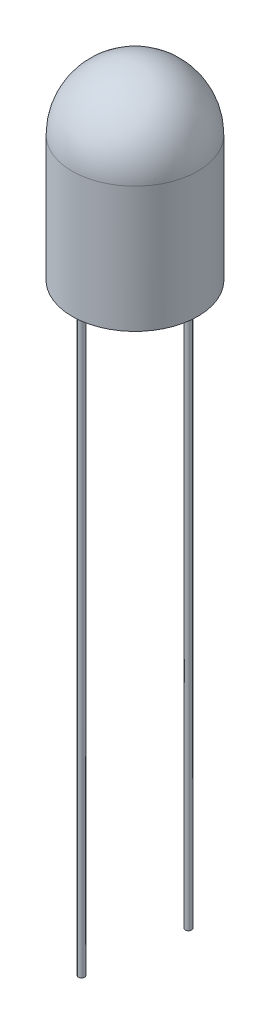
ISO-10303-21;
HEADER;
FILE_DESCRIPTION(('STEP AP214'),'2;1');
FILE_NAME('part.step','',(''),(''),'','','');
FILE_SCHEMA(('AUTOMOTIVE_DESIGN { 1 0 10303 214 1 1 1 1 }'));
ENDSEC;
DATA;
#1=APPLICATION_CONTEXT('core data for automotive mechanical design processes');
#2=APPLICATION_PROTOCOL_DEFINITION('international standard','automotive_design',2000,#1);
#3=PRODUCT_CONTEXT('',#1,'mechanical');
#4=PRODUCT('Part','Part','',(#3));
#5=PRODUCT_RELATED_PRODUCT_CATEGORY('part','',(#4));
#6=PRODUCT_DEFINITION_FORMATION('','',#4);
#7=PRODUCT_DEFINITION_CONTEXT('part definition',#1,'design');
#8=PRODUCT_DEFINITION('design','',#6,#7);
#9=PRODUCT_DEFINITION_SHAPE('','',#8);
#10=(LENGTH_UNIT() NAMED_UNIT(*) SI_UNIT(.MILLI.,.METRE.));
#11=(NAMED_UNIT(*) PLANE_ANGLE_UNIT() SI_UNIT($,.RADIAN.));
#12=(NAMED_UNIT(*) SI_UNIT($,.STERADIAN.) SOLID_ANGLE_UNIT());
#13=UNCERTAINTY_MEASURE_WITH_UNIT(LENGTH_MEASURE(1.E-05),#10,'distance_accuracy_value','');
#14=(GEOMETRIC_REPRESENTATION_CONTEXT(3) GLOBAL_UNCERTAINTY_ASSIGNED_CONTEXT((#13)) GLOBAL_UNIT_ASSIGNED_CONTEXT((#10,
#11,#12)) REPRESENTATION_CONTEXT('',''));
#15=CARTESIAN_POINT('',(0.,0.,0.));
#16=DIRECTION('',(0.,0.,1.));
#17=DIRECTION('',(1.,0.,0.));
#18=AXIS2_PLACEMENT_3D('',#15,#16,#17);
#19=CARTESIAN_POINT('',(0.,0.,0.));
#20=DIRECTION('',(0.,1.,0.));
#21=DIRECTION('',(0.,0.,1.));
#22=AXIS2_PLACEMENT_3D('',#19,#20,#21);
#23=PLANE('',#22);
#24=CARTESIAN_POINT('',(0.85,0.,0.));
#25=DIRECTION('',(0.,1.,0.));
#26=DIRECTION('',(0.,0.,1.));
#27=AXIS2_PLACEMENT_3D('',#24,#25,#26);
#28=CIRCLE('',#27,0.0500000000000001);
#29=CARTESIAN_POINT('',(0.85,0.,0.0500000000000001));
#30=VERTEX_POINT('',#29);
#31=EDGE_CURVE('E10',#30,#30,#28,.F.);
#32=ORIENTED_EDGE('',*,*,#31,.F.);
#33=EDGE_LOOP('',(#32));
#34=FACE_BOUND('',#33,.T.);
#35=CARTESIAN_POINT('',(-0.85,0.,0.));
#36=DIRECTION('',(0.,1.,0.));
#37=DIRECTION('',(0.,0.,1.));
#38=AXIS2_PLACEMENT_3D('',#35,#36,#37);
#39=CIRCLE('',#38,0.0500000000000001);
#40=CARTESIAN_POINT('',(-0.85,0.,0.0500000000000001));
#41=VERTEX_POINT('',#40);
#42=EDGE_CURVE('E40',#41,#41,#39,.F.);
#43=ORIENTED_EDGE('',*,*,#42,.F.);
#44=EDGE_LOOP('',(#43));
#45=FACE_BOUND('',#44,.T.);
#46=CARTESIAN_POINT('',(0.,0.,0.));
#47=DIRECTION('',(0.,1.,0.));
#48=DIRECTION('',(0.,0.,1.));
#49=AXIS2_PLACEMENT_3D('',#46,#47,#48);
#50=CIRCLE('',#49,1.);
#51=CARTESIAN_POINT('',(0.,0.,1.));
#52=VERTEX_POINT('',#51);
#53=EDGE_CURVE('E44',#52,#52,#50,.T.);
#54=ORIENTED_EDGE('',*,*,#53,.F.);
#55=EDGE_LOOP('',(#54));
#56=FACE_BOUND('',#55,.T.);
#57=ADVANCED_FACE('F34',(#34,#45,#56),#23,.F.);
#58=CARTESIAN_POINT('',(0.,4.37497709116596,0.));
#59=DIRECTION('',(0.,1.,0.));
#60=DIRECTION('',(0.,0.,1.));
#61=AXIS2_PLACEMENT_3D('',#58,#59,#60);
#62=CYLINDRICAL_SURFACE('',#61,1.);
#63=CARTESIAN_POINT('',(0.,2.,0.));
#64=DIRECTION('',(0.,1.,0.));
#65=DIRECTION('',(0.,0.,1.));
#66=AXIS2_PLACEMENT_3D('',#63,#64,#65);
#67=CIRCLE('',#66,1.);
#68=CARTESIAN_POINT('',(0.,2.,1.));
#69=VERTEX_POINT('',#68);
#70=EDGE_CURVE('E48',#69,#69,#67,.T.);
#71=ORIENTED_EDGE('',*,*,#70,.F.);
#72=EDGE_LOOP('',(#71));
#73=FACE_BOUND('',#72,.T.);
#74=ORIENTED_EDGE('',*,*,#53,.T.);
#75=EDGE_LOOP('',(#74));
#76=FACE_BOUND('',#75,.T.);
#77=ADVANCED_FACE('F75',(#73,#76),#62,.T.);
#78=CARTESIAN_POINT('',(0.,2.,0.));
#79=DIRECTION('',(0.,1.,0.));
#80=DIRECTION('',(1.,0.,0.));
#81=AXIS2_PLACEMENT_3D('',#78,#79,#80);
#82=SPHERICAL_SURFACE('',#81,1.);
#83=ORIENTED_EDGE('',*,*,#70,.T.);
#84=EDGE_LOOP('',(#83));
#85=FACE_BOUND('',#84,.T.);
#86=ADVANCED_FACE('F80',(#85),#82,.T.);
#87=CARTESIAN_POINT('',(-0.85,-10.,0.));
#88=DIRECTION('',(0.,1.,0.));
#89=DIRECTION('',(0.,0.,1.));
#90=AXIS2_PLACEMENT_3D('',#87,#88,#89);
#91=CYLINDRICAL_SURFACE('',#90,0.0500000000000001);
#92=CARTESIAN_POINT('',(-0.85,-10.,0.));
#93=DIRECTION('',(0.,-1.,0.));
#94=DIRECTION('',(0.,0.,-1.));
#95=AXIS2_PLACEMENT_3D('',#92,#93,#94);
#96=CIRCLE('',#95,0.0500000000000001);
#97=CARTESIAN_POINT('',(-0.85,-10.,-0.0500000000000001));
#98=VERTEX_POINT('',#97);
#99=EDGE_CURVE('E53',#98,#98,#96,.T.);
#100=ORIENTED_EDGE('',*,*,#99,.F.);
#101=EDGE_LOOP('',(#100));
#102=FACE_BOUND('',#101,.T.);
#103=ORIENTED_EDGE('',*,*,#42,.T.);
#104=EDGE_LOOP('',(#103));
#105=FACE_BOUND('',#104,.T.);
#106=ADVANCED_FACE('F71',(#102,#105),#91,.T.);
#107=CARTESIAN_POINT('',(0.,-10.,0.));
#108=DIRECTION('',(0.,-1.,0.));
#109=DIRECTION('',(0.,0.,-1.));
#110=AXIS2_PLACEMENT_3D('',#107,#108,#109);
#111=PLANE('',#110);
#112=ORIENTED_EDGE('',*,*,#99,.T.);
#113=EDGE_LOOP('',(#112));
#114=FACE_BOUND('',#113,.T.);
#115=ADVANCED_FACE('F64',(#114),#111,.T.);
#116=CARTESIAN_POINT('',(0.85,-8.5,0.));
#117=DIRECTION('',(0.,1.,0.));
#118=DIRECTION('',(0.,0.,1.));
#119=AXIS2_PLACEMENT_3D('',#116,#117,#118);
#120=CYLINDRICAL_SURFACE('',#119,0.0500000000000001);
#121=CARTESIAN_POINT('',(0.85,-8.5,0.));
#122=DIRECTION('',(0.,-1.,0.));
#123=DIRECTION('',(0.,0.,-1.));
#124=AXIS2_PLACEMENT_3D('',#121,#122,#123);
#125=CIRCLE('',#124,0.0500000000000001);
#126=CARTESIAN_POINT('',(0.85,-8.5,-0.0500000000000001));
#127=VERTEX_POINT('',#126);
#128=EDGE_CURVE('E56',#127,#127,#125,.T.);
#129=ORIENTED_EDGE('',*,*,#128,.F.);
#130=EDGE_LOOP('',(#129));
#131=FACE_BOUND('',#130,.T.);
#132=ORIENTED_EDGE('',*,*,#31,.T.);
#133=EDGE_LOOP('',(#132));
#134=FACE_BOUND('',#133,.T.);
#135=ADVANCED_FACE('F62',(#131,#134),#120,.T.);
#136=CARTESIAN_POINT('',(0.,-8.5,0.));
#137=DIRECTION('',(0.,-1.,0.));
#138=DIRECTION('',(0.,0.,-1.));
#139=AXIS2_PLACEMENT_3D('',#136,#137,#138);
#140=PLANE('',#139);
#141=ORIENTED_EDGE('',*,*,#128,.T.);
#142=EDGE_LOOP('',(#141));
#143=FACE_BOUND('',#142,.T.);
#144=ADVANCED_FACE('F60',(#143),#140,.T.);
#145=CLOSED_SHELL('',(#57,#77,#86,#106,#115,#135,#144));
#146=MANIFOLD_SOLID_BREP('B2',#145);
#147=ADVANCED_BREP_SHAPE_REPRESENTATION('',(#18,#146),#14);
#148=SHAPE_DEFINITION_REPRESENTATION(#9,#147);
ENDSEC;
END-ISO-10303-21;
